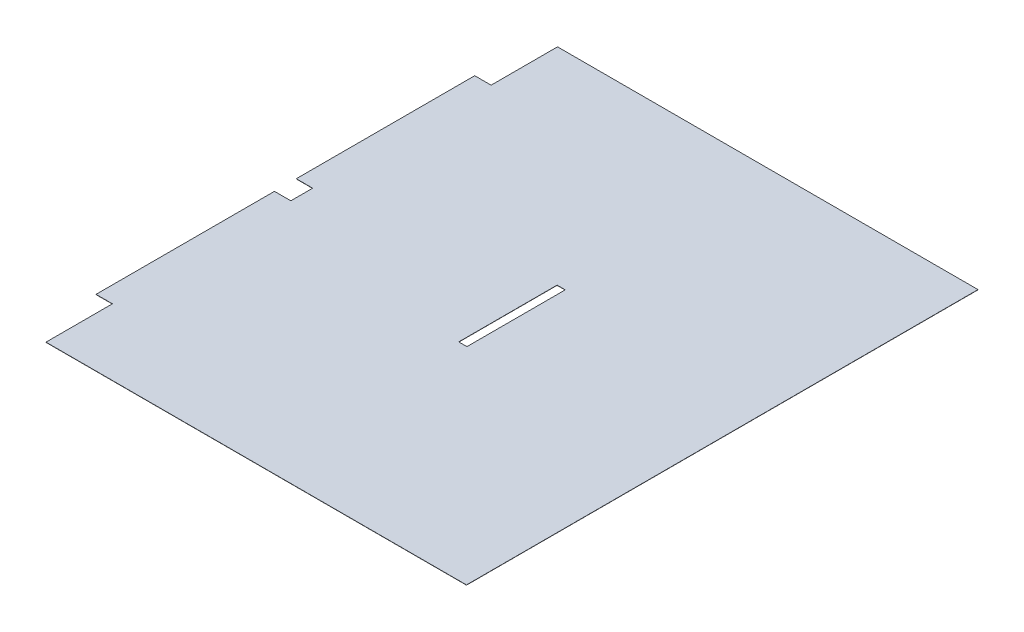
ISO-10303-21;
HEADER;
FILE_DESCRIPTION(('STEP AP214'),'2;1');
FILE_NAME('part.step','',(''),(''),'','','');
FILE_SCHEMA(('AUTOMOTIVE_DESIGN { 1 0 10303 214 1 1 1 1 }'));
ENDSEC;
DATA;
#1=APPLICATION_CONTEXT('core data for automotive mechanical design processes');
#2=APPLICATION_PROTOCOL_DEFINITION('international standard','automotive_design',2000,#1);
#3=PRODUCT_CONTEXT('',#1,'mechanical');
#4=PRODUCT('Part','Part','',(#3));
#5=PRODUCT_RELATED_PRODUCT_CATEGORY('part','',(#4));
#6=PRODUCT_DEFINITION_FORMATION('','',#4);
#7=PRODUCT_DEFINITION_CONTEXT('part definition',#1,'design');
#8=PRODUCT_DEFINITION('design','',#6,#7);
#9=PRODUCT_DEFINITION_SHAPE('','',#8);
#10=(LENGTH_UNIT() NAMED_UNIT(*) SI_UNIT(.MILLI.,.METRE.));
#11=(NAMED_UNIT(*) PLANE_ANGLE_UNIT() SI_UNIT($,.RADIAN.));
#12=(NAMED_UNIT(*) SI_UNIT($,.STERADIAN.) SOLID_ANGLE_UNIT());
#13=UNCERTAINTY_MEASURE_WITH_UNIT(LENGTH_MEASURE(1.E-05),#10,'distance_accuracy_value','');
#14=(GEOMETRIC_REPRESENTATION_CONTEXT(3) GLOBAL_UNCERTAINTY_ASSIGNED_CONTEXT((#13)) GLOBAL_UNIT_ASSIGNED_CONTEXT((#10,
#11,#12)) REPRESENTATION_CONTEXT('',''));
#15=CARTESIAN_POINT('',(0.,0.,0.));
#16=DIRECTION('',(0.,0.,1.));
#17=DIRECTION('',(1.,0.,0.));
#18=AXIS2_PLACEMENT_3D('',#15,#16,#17);
#19=CARTESIAN_POINT('',(-124.475,61.327,0.));
#20=DIRECTION('',(1.,0.,0.));
#21=DIRECTION('',(0.,0.,-1.));
#22=AXIS2_PLACEMENT_3D('',#19,#20,#21);
#23=PLANE('',#22);
#24=DIRECTION('',(0.,0.,1.));
#25=VECTOR('',#24,1.);
#26=CARTESIAN_POINT('',(-124.475,61.2,0.));
#27=LINE('',#26,#25);
#28=CARTESIAN_POINT('',(-124.475,61.2,6.00000000000006));
#29=VERTEX_POINT('',#28);
#30=CARTESIAN_POINT('',(-124.475,61.2,104.));
#31=VERTEX_POINT('',#30);
#32=EDGE_CURVE('E205',#29,#31,#27,.T.);
#33=ORIENTED_EDGE('',*,*,#32,.T.);
#34=DIRECTION('',(0.,-1.,0.));
#35=VECTOR('',#34,1.);
#36=CARTESIAN_POINT('',(-124.475,61.327,104.));
#37=LINE('',#36,#35);
#38=CARTESIAN_POINT('',(-124.475,61.327,104.));
#39=VERTEX_POINT('',#38);
#40=EDGE_CURVE('E11',#39,#31,#37,.T.);
#41=ORIENTED_EDGE('',*,*,#40,.F.);
#42=DIRECTION('',(0.,0.,1.));
#43=VECTOR('',#42,1.);
#44=CARTESIAN_POINT('',(-124.475,61.327,0.));
#45=LINE('',#44,#43);
#46=CARTESIAN_POINT('',(-124.475,61.327,6.00000000000006));
#47=VERTEX_POINT('',#46);
#48=EDGE_CURVE('E461',#47,#39,#45,.T.);
#49=ORIENTED_EDGE('',*,*,#48,.F.);
#50=DIRECTION('',(0.,-1.,0.));
#51=VECTOR('',#50,1.);
#52=CARTESIAN_POINT('',(-124.475,61.327,6.00000000000006));
#53=LINE('',#52,#51);
#54=EDGE_CURVE('E60',#47,#29,#53,.T.);
#55=ORIENTED_EDGE('',*,*,#54,.T.);
#56=EDGE_LOOP('',(#33,#41,#49,#55));
#57=FACE_BOUND('',#56,.T.);
#58=ADVANCED_FACE('F41',(#57),#23,.F.);
#59=CARTESIAN_POINT('',(0.,61.327,104.));
#60=DIRECTION('',(0.,0.,-1.));
#61=DIRECTION('',(-1.,0.,0.));
#62=AXIS2_PLACEMENT_3D('',#59,#60,#61);
#63=PLANE('',#62);
#64=DIRECTION('',(1.,0.,0.));
#65=VECTOR('',#64,1.);
#66=CARTESIAN_POINT('',(0.,61.2,104.));
#67=LINE('',#66,#65);
#68=CARTESIAN_POINT('',(-115.475,61.2,104.));
#69=VERTEX_POINT('',#68);
#70=EDGE_CURVE('E207',#31,#69,#67,.T.);
#71=ORIENTED_EDGE('',*,*,#70,.T.);
#72=DIRECTION('',(0.,-1.,0.));
#73=VECTOR('',#72,1.);
#74=CARTESIAN_POINT('',(-115.475,61.327,104.));
#75=LINE('',#74,#73);
#76=CARTESIAN_POINT('',(-115.475,61.327,104.));
#77=VERTEX_POINT('',#76);
#78=EDGE_CURVE('E51',#77,#69,#75,.T.);
#79=ORIENTED_EDGE('',*,*,#78,.F.);
#80=DIRECTION('',(1.,0.,0.));
#81=VECTOR('',#80,1.);
#82=CARTESIAN_POINT('',(0.,61.327,104.));
#83=LINE('',#82,#81);
#84=EDGE_CURVE('E464',#39,#77,#83,.T.);
#85=ORIENTED_EDGE('',*,*,#84,.F.);
#86=ORIENTED_EDGE('',*,*,#40,.T.);
#87=EDGE_LOOP('',(#71,#79,#85,#86));
#88=FACE_BOUND('',#87,.T.);
#89=ADVANCED_FACE('F283',(#88),#63,.F.);
#90=CARTESIAN_POINT('',(-115.475,61.327,1.31805692702457E-13));
#91=DIRECTION('',(1.,0.,0.));
#92=DIRECTION('',(0.,0.,-1.));
#93=AXIS2_PLACEMENT_3D('',#90,#91,#92);
#94=PLANE('',#93);
#95=DIRECTION('',(0.,0.,1.));
#96=VECTOR('',#95,1.);
#97=CARTESIAN_POINT('',(-115.475,61.2,1.31805692702457E-13));
#98=LINE('',#97,#96);
#99=CARTESIAN_POINT('',(-115.475,61.2,140.475));
#100=VERTEX_POINT('',#99);
#101=EDGE_CURVE('E210',#69,#100,#98,.T.);
#102=ORIENTED_EDGE('',*,*,#101,.T.);
#103=DIRECTION('',(0.,-1.,0.));
#104=VECTOR('',#103,1.);
#105=CARTESIAN_POINT('',(-115.475,61.327,140.475));
#106=LINE('',#105,#104);
#107=CARTESIAN_POINT('',(-115.475,61.327,140.475));
#108=VERTEX_POINT('',#107);
#109=EDGE_CURVE('E247',#108,#100,#106,.T.);
#110=ORIENTED_EDGE('',*,*,#109,.F.);
#111=DIRECTION('',(0.,0.,1.));
#112=VECTOR('',#111,1.);
#113=CARTESIAN_POINT('',(-115.475,61.327,1.31805692702457E-13));
#114=LINE('',#113,#112);
#115=EDGE_CURVE('E453',#77,#108,#114,.T.);
#116=ORIENTED_EDGE('',*,*,#115,.F.);
#117=ORIENTED_EDGE('',*,*,#78,.T.);
#118=EDGE_LOOP('',(#102,#110,#116,#117));
#119=FACE_BOUND('',#118,.T.);
#120=ADVANCED_FACE('F289',(#119),#94,.F.);
#121=CARTESIAN_POINT('',(0.,61.327,140.475));
#122=DIRECTION('',(0.,0.,-1.));
#123=DIRECTION('',(-1.,0.,0.));
#124=AXIS2_PLACEMENT_3D('',#121,#122,#123);
#125=PLANE('',#124);
#126=DIRECTION('',(1.,0.,0.));
#127=VECTOR('',#126,1.);
#128=CARTESIAN_POINT('',(0.,61.2,140.475));
#129=LINE('',#128,#127);
#130=CARTESIAN_POINT('',(115.475,61.2,140.475));
#131=VERTEX_POINT('',#130);
#132=EDGE_CURVE('E212',#100,#131,#129,.T.);
#133=ORIENTED_EDGE('',*,*,#132,.T.);
#134=DIRECTION('',(0.,-1.,0.));
#135=VECTOR('',#134,1.);
#136=CARTESIAN_POINT('',(115.475,61.327,140.475));
#137=LINE('',#136,#135);
#138=CARTESIAN_POINT('',(115.475,61.327,140.475));
#139=VERTEX_POINT('',#138);
#140=EDGE_CURVE('E245',#139,#131,#137,.T.);
#141=ORIENTED_EDGE('',*,*,#140,.F.);
#142=DIRECTION('',(1.,0.,0.));
#143=VECTOR('',#142,1.);
#144=CARTESIAN_POINT('',(0.,61.327,140.475));
#145=LINE('',#144,#143);
#146=EDGE_CURVE('E441',#108,#139,#145,.T.);
#147=ORIENTED_EDGE('',*,*,#146,.F.);
#148=ORIENTED_EDGE('',*,*,#109,.T.);
#149=EDGE_LOOP('',(#133,#141,#147,#148));
#150=FACE_BOUND('',#149,.T.);
#151=ADVANCED_FACE('F398',(#150),#125,.F.);
#152=CARTESIAN_POINT('',(115.475,61.327,0.));
#153=DIRECTION('',(1.,0.,0.));
#154=DIRECTION('',(0.,0.,-1.));
#155=AXIS2_PLACEMENT_3D('',#152,#153,#154);
#156=PLANE('',#155);
#157=DIRECTION('',(0.,0.,1.));
#158=VECTOR('',#157,1.);
#159=CARTESIAN_POINT('',(115.475,61.2,0.));
#160=LINE('',#159,#158);
#161=CARTESIAN_POINT('',(115.475,61.2,-140.475));
#162=VERTEX_POINT('',#161);
#163=EDGE_CURVE('E215',#162,#131,#160,.T.);
#164=ORIENTED_EDGE('',*,*,#163,.F.);
#165=DIRECTION('',(0.,-1.,0.));
#166=VECTOR('',#165,1.);
#167=CARTESIAN_POINT('',(115.475,61.327,-140.475));
#168=LINE('',#167,#166);
#169=CARTESIAN_POINT('',(115.475,61.327,-140.475));
#170=VERTEX_POINT('',#169);
#171=EDGE_CURVE('E243',#170,#162,#168,.T.);
#172=ORIENTED_EDGE('',*,*,#171,.F.);
#173=DIRECTION('',(0.,0.,1.));
#174=VECTOR('',#173,1.);
#175=CARTESIAN_POINT('',(115.475,61.327,0.));
#176=LINE('',#175,#174);
#177=EDGE_CURVE('E446',#170,#139,#176,.T.);
#178=ORIENTED_EDGE('',*,*,#177,.T.);
#179=ORIENTED_EDGE('',*,*,#140,.T.);
#180=EDGE_LOOP('',(#164,#172,#178,#179));
#181=FACE_BOUND('',#180,.T.);
#182=ADVANCED_FACE('F389',(#181),#156,.T.);
#183=CARTESIAN_POINT('',(0.,61.327,-140.475));
#184=DIRECTION('',(0.,0.,-1.));
#185=DIRECTION('',(-1.,0.,0.));
#186=AXIS2_PLACEMENT_3D('',#183,#184,#185);
#187=PLANE('',#186);
#188=DIRECTION('',(1.,0.,0.));
#189=VECTOR('',#188,1.);
#190=CARTESIAN_POINT('',(0.,61.2,-140.475));
#191=LINE('',#190,#189);
#192=CARTESIAN_POINT('',(-115.475,61.2,-140.475));
#193=VERTEX_POINT('',#192);
#194=EDGE_CURVE('E218',#193,#162,#191,.T.);
#195=ORIENTED_EDGE('',*,*,#194,.F.);
#196=DIRECTION('',(0.,-1.,0.));
#197=VECTOR('',#196,1.);
#198=CARTESIAN_POINT('',(-115.475,61.327,-140.475));
#199=LINE('',#198,#197);
#200=CARTESIAN_POINT('',(-115.475,61.327,-140.475));
#201=VERTEX_POINT('',#200);
#202=EDGE_CURVE('E241',#201,#193,#199,.T.);
#203=ORIENTED_EDGE('',*,*,#202,.F.);
#204=DIRECTION('',(1.,0.,0.));
#205=VECTOR('',#204,1.);
#206=CARTESIAN_POINT('',(0.,61.327,-140.475));
#207=LINE('',#206,#205);
#208=EDGE_CURVE('E449',#201,#170,#207,.T.);
#209=ORIENTED_EDGE('',*,*,#208,.T.);
#210=ORIENTED_EDGE('',*,*,#171,.T.);
#211=EDGE_LOOP('',(#195,#203,#209,#210));
#212=FACE_BOUND('',#211,.T.);
#213=ADVANCED_FACE('F380',(#212),#187,.T.);
#214=CARTESIAN_POINT('',(-115.475,61.327,0.));
#215=DIRECTION('',(-1.,0.,0.));
#216=DIRECTION('',(0.,0.,1.));
#217=AXIS2_PLACEMENT_3D('',#214,#215,#216);
#218=PLANE('',#217);
#219=DIRECTION('',(0.,0.,-1.));
#220=VECTOR('',#219,1.);
#221=CARTESIAN_POINT('',(-115.475,61.2,0.));
#222=LINE('',#221,#220);
#223=CARTESIAN_POINT('',(-115.475,61.2,-104.));
#224=VERTEX_POINT('',#223);
#225=EDGE_CURVE('E221',#224,#193,#222,.T.);
#226=ORIENTED_EDGE('',*,*,#225,.F.);
#227=DIRECTION('',(0.,-1.,0.));
#228=VECTOR('',#227,1.);
#229=CARTESIAN_POINT('',(-115.475,61.327,-104.));
#230=LINE('',#229,#228);
#231=CARTESIAN_POINT('',(-115.475,61.327,-104.));
#232=VERTEX_POINT('',#231);
#233=EDGE_CURVE('E239',#232,#224,#230,.T.);
#234=ORIENTED_EDGE('',*,*,#233,.F.);
#235=DIRECTION('',(0.,0.,-1.));
#236=VECTOR('',#235,1.);
#237=CARTESIAN_POINT('',(-115.475,61.327,0.));
#238=LINE('',#237,#236);
#239=EDGE_CURVE('E451',#232,#201,#238,.T.);
#240=ORIENTED_EDGE('',*,*,#239,.T.);
#241=ORIENTED_EDGE('',*,*,#202,.T.);
#242=EDGE_LOOP('',(#226,#234,#240,#241));
#243=FACE_BOUND('',#242,.T.);
#244=ADVANCED_FACE('F301',(#243),#218,.T.);
#245=CARTESIAN_POINT('',(0.,61.327,-104.));
#246=DIRECTION('',(0.,0.,-1.));
#247=DIRECTION('',(-1.,0.,0.));
#248=AXIS2_PLACEMENT_3D('',#245,#246,#247);
#249=PLANE('',#248);
#250=DIRECTION('',(1.,0.,0.));
#251=VECTOR('',#250,1.);
#252=CARTESIAN_POINT('',(0.,61.2,-104.));
#253=LINE('',#252,#251);
#254=CARTESIAN_POINT('',(-124.475,61.2,-104.));
#255=VERTEX_POINT('',#254);
#256=EDGE_CURVE('E224',#255,#224,#253,.T.);
#257=ORIENTED_EDGE('',*,*,#256,.F.);
#258=DIRECTION('',(0.,-1.,0.));
#259=VECTOR('',#258,1.);
#260=CARTESIAN_POINT('',(-124.475,61.327,-104.));
#261=LINE('',#260,#259);
#262=CARTESIAN_POINT('',(-124.475,61.327,-104.));
#263=VERTEX_POINT('',#262);
#264=EDGE_CURVE('E237',#263,#255,#261,.T.);
#265=ORIENTED_EDGE('',*,*,#264,.F.);
#266=DIRECTION('',(1.,0.,0.));
#267=VECTOR('',#266,1.);
#268=CARTESIAN_POINT('',(0.,61.327,-104.));
#269=LINE('',#268,#267);
#270=EDGE_CURVE('E458',#263,#232,#269,.T.);
#271=ORIENTED_EDGE('',*,*,#270,.T.);
#272=ORIENTED_EDGE('',*,*,#233,.T.);
#273=EDGE_LOOP('',(#257,#265,#271,#272));
#274=FACE_BOUND('',#273,.T.);
#275=ADVANCED_FACE('F295',(#274),#249,.T.);
#276=CARTESIAN_POINT('',(-124.475,61.2,-5.99999999999994));
#277=VERTEX_POINT('',#276);
#278=EDGE_CURVE('E208',#255,#277,#27,.T.);
#279=ORIENTED_EDGE('',*,*,#278,.T.);
#280=DIRECTION('',(0.,-1.,0.));
#281=VECTOR('',#280,1.);
#282=CARTESIAN_POINT('',(-124.475,61.327,-5.99999999999994));
#283=LINE('',#282,#281);
#284=CARTESIAN_POINT('',(-124.475,61.327,-5.99999999999994));
#285=VERTEX_POINT('',#284);
#286=EDGE_CURVE('E184',#285,#277,#283,.T.);
#287=ORIENTED_EDGE('',*,*,#286,.F.);
#288=EDGE_CURVE('E172',#263,#285,#45,.T.);
#289=ORIENTED_EDGE('',*,*,#288,.F.);
#290=ORIENTED_EDGE('',*,*,#264,.T.);
#291=EDGE_LOOP('',(#279,#287,#289,#290));
#292=FACE_BOUND('',#291,.T.);
#293=ADVANCED_FACE('F285',(#292),#23,.F.);
#294=CARTESIAN_POINT('',(0.,61.327,-5.99999999999994));
#295=DIRECTION('',(0.,0.,-1.));
#296=DIRECTION('',(-1.,0.,0.));
#297=AXIS2_PLACEMENT_3D('',#294,#295,#296);
#298=PLANE('',#297);
#299=DIRECTION('',(1.,0.,0.));
#300=VECTOR('',#299,1.);
#301=CARTESIAN_POINT('',(0.,61.2,-5.99999999999994));
#302=LINE('',#301,#300);
#303=CARTESIAN_POINT('',(-115.475,61.2,-5.99999999999994));
#304=VERTEX_POINT('',#303);
#305=EDGE_CURVE('E181',#277,#304,#302,.T.);
#306=ORIENTED_EDGE('',*,*,#305,.T.);
#307=DIRECTION('',(0.,-1.,0.));
#308=VECTOR('',#307,1.);
#309=CARTESIAN_POINT('',(-115.475,61.327,-5.99999999999994));
#310=LINE('',#309,#308);
#311=CARTESIAN_POINT('',(-115.475,61.327,-5.99999999999994));
#312=VERTEX_POINT('',#311);
#313=EDGE_CURVE('E178',#312,#304,#310,.T.);
#314=ORIENTED_EDGE('',*,*,#313,.F.);
#315=DIRECTION('',(1.,0.,0.));
#316=VECTOR('',#315,1.);
#317=CARTESIAN_POINT('',(0.,61.327,-5.99999999999994));
#318=LINE('',#317,#316);
#319=EDGE_CURVE('E163',#285,#312,#318,.T.);
#320=ORIENTED_EDGE('',*,*,#319,.F.);
#321=ORIENTED_EDGE('',*,*,#286,.T.);
#322=EDGE_LOOP('',(#306,#314,#320,#321));
#323=FACE_BOUND('',#322,.T.);
#324=ADVANCED_FACE('F179',(#323),#298,.F.);
#325=CARTESIAN_POINT('',(-115.475,61.327,0.));
#326=DIRECTION('',(1.,0.,0.));
#327=DIRECTION('',(0.,0.,-1.));
#328=AXIS2_PLACEMENT_3D('',#325,#326,#327);
#329=PLANE('',#328);
#330=DIRECTION('',(0.,0.,1.));
#331=VECTOR('',#330,1.);
#332=CARTESIAN_POINT('',(-115.475,61.2,0.));
#333=LINE('',#332,#331);
#334=CARTESIAN_POINT('',(-115.475,61.2,6.00000000000006));
#335=VERTEX_POINT('',#334);
#336=EDGE_CURVE('E228',#304,#335,#333,.T.);
#337=ORIENTED_EDGE('',*,*,#336,.T.);
#338=DIRECTION('',(0.,-1.,0.));
#339=VECTOR('',#338,1.);
#340=CARTESIAN_POINT('',(-115.475,61.327,6.00000000000006));
#341=LINE('',#340,#339);
#342=CARTESIAN_POINT('',(-115.475,61.327,6.00000000000006));
#343=VERTEX_POINT('',#342);
#344=EDGE_CURVE('E111',#343,#335,#341,.T.);
#345=ORIENTED_EDGE('',*,*,#344,.F.);
#346=DIRECTION('',(0.,0.,1.));
#347=VECTOR('',#346,1.);
#348=CARTESIAN_POINT('',(-115.475,61.327,0.));
#349=LINE('',#348,#347);
#350=EDGE_CURVE('E169',#312,#343,#349,.T.);
#351=ORIENTED_EDGE('',*,*,#350,.F.);
#352=ORIENTED_EDGE('',*,*,#313,.T.);
#353=EDGE_LOOP('',(#337,#345,#351,#352));
#354=FACE_BOUND('',#353,.T.);
#355=ADVANCED_FACE('F186',(#354),#329,.F.);
#356=CARTESIAN_POINT('',(0.,61.327,-27.));
#357=DIRECTION('',(0.,0.,-1.));
#358=DIRECTION('',(-1.,0.,0.));
#359=AXIS2_PLACEMENT_3D('',#356,#357,#358);
#360=PLANE('',#359);
#361=DIRECTION('',(1.,0.,0.));
#362=VECTOR('',#361,1.);
#363=CARTESIAN_POINT('',(0.,61.2,-27.));
#364=LINE('',#363,#362);
#365=CARTESIAN_POINT('',(-2.25,61.2,-27.));
#366=VERTEX_POINT('',#365);
#367=CARTESIAN_POINT('',(2.25,61.2,-27.));
#368=VERTEX_POINT('',#367);
#369=EDGE_CURVE('E193',#366,#368,#364,.T.);
#370=ORIENTED_EDGE('',*,*,#369,.T.);
#371=DIRECTION('',(0.,-1.,0.));
#372=VECTOR('',#371,1.);
#373=CARTESIAN_POINT('',(2.25,61.327,-27.));
#374=LINE('',#373,#372);
#375=CARTESIAN_POINT('',(2.25,61.327,-27.));
#376=VERTEX_POINT('',#375);
#377=EDGE_CURVE('E45',#376,#368,#374,.T.);
#378=ORIENTED_EDGE('',*,*,#377,.F.);
#379=DIRECTION('',(1.,0.,0.));
#380=VECTOR('',#379,1.);
#381=CARTESIAN_POINT('',(0.,61.327,-27.));
#382=LINE('',#381,#380);
#383=CARTESIAN_POINT('',(-2.25,61.327,-27.));
#384=VERTEX_POINT('',#383);
#385=EDGE_CURVE('E233',#384,#376,#382,.T.);
#386=ORIENTED_EDGE('',*,*,#385,.F.);
#387=DIRECTION('',(0.,-1.,0.));
#388=VECTOR('',#387,1.);
#389=CARTESIAN_POINT('',(-2.25,61.327,-27.));
#390=LINE('',#389,#388);
#391=EDGE_CURVE('E189',#384,#366,#390,.T.);
#392=ORIENTED_EDGE('',*,*,#391,.T.);
#393=EDGE_LOOP('',(#370,#378,#386,#392));
#394=FACE_BOUND('',#393,.T.);
#395=ADVANCED_FACE('F43',(#394),#360,.F.);
#396=CARTESIAN_POINT('',(2.25,61.327,0.));
#397=DIRECTION('',(1.,0.,0.));
#398=DIRECTION('',(0.,0.,-1.));
#399=AXIS2_PLACEMENT_3D('',#396,#397,#398);
#400=PLANE('',#399);
#401=DIRECTION('',(0.,0.,1.));
#402=VECTOR('',#401,1.);
#403=CARTESIAN_POINT('',(2.25,61.2,0.));
#404=LINE('',#403,#402);
#405=CARTESIAN_POINT('',(2.25,61.2,27.));
#406=VERTEX_POINT('',#405);
#407=EDGE_CURVE('E196',#368,#406,#404,.T.);
#408=ORIENTED_EDGE('',*,*,#407,.T.);
#409=DIRECTION('',(0.,-1.,0.));
#410=VECTOR('',#409,1.);
#411=CARTESIAN_POINT('',(2.25,61.327,27.));
#412=LINE('',#411,#410);
#413=CARTESIAN_POINT('',(2.25,61.327,27.));
#414=VERTEX_POINT('',#413);
#415=EDGE_CURVE('E254',#414,#406,#412,.T.);
#416=ORIENTED_EDGE('',*,*,#415,.F.);
#417=DIRECTION('',(0.,0.,1.));
#418=VECTOR('',#417,1.);
#419=CARTESIAN_POINT('',(2.25,61.327,0.));
#420=LINE('',#419,#418);
#421=EDGE_CURVE('E124',#376,#414,#420,.T.);
#422=ORIENTED_EDGE('',*,*,#421,.F.);
#423=ORIENTED_EDGE('',*,*,#377,.T.);
#424=EDGE_LOOP('',(#408,#416,#422,#423));
#425=FACE_BOUND('',#424,.T.);
#426=ADVANCED_FACE('F259',(#425),#400,.F.);
#427=CARTESIAN_POINT('',(0.,61.327,27.));
#428=DIRECTION('',(0.,0.,-1.));
#429=DIRECTION('',(-1.,0.,0.));
#430=AXIS2_PLACEMENT_3D('',#427,#428,#429);
#431=PLANE('',#430);
#432=DIRECTION('',(1.,0.,0.));
#433=VECTOR('',#432,1.);
#434=CARTESIAN_POINT('',(0.,61.2,27.));
#435=LINE('',#434,#433);
#436=CARTESIAN_POINT('',(-2.25,61.2,27.));
#437=VERTEX_POINT('',#436);
#438=EDGE_CURVE('E199',#437,#406,#435,.T.);
#439=ORIENTED_EDGE('',*,*,#438,.F.);
#440=DIRECTION('',(0.,-1.,0.));
#441=VECTOR('',#440,1.);
#442=CARTESIAN_POINT('',(-2.25,61.327,27.));
#443=LINE('',#442,#441);
#444=CARTESIAN_POINT('',(-2.25,61.327,27.));
#445=VERTEX_POINT('',#444);
#446=EDGE_CURVE('E253',#445,#437,#443,.T.);
#447=ORIENTED_EDGE('',*,*,#446,.F.);
#448=DIRECTION('',(1.,0.,0.));
#449=VECTOR('',#448,1.);
#450=CARTESIAN_POINT('',(0.,61.327,27.));
#451=LINE('',#450,#449);
#452=EDGE_CURVE('E466',#445,#414,#451,.T.);
#453=ORIENTED_EDGE('',*,*,#452,.T.);
#454=ORIENTED_EDGE('',*,*,#415,.T.);
#455=EDGE_LOOP('',(#439,#447,#453,#454));
#456=FACE_BOUND('',#455,.T.);
#457=ADVANCED_FACE('F273',(#456),#431,.T.);
#458=CARTESIAN_POINT('',(-2.25,61.327,0.));
#459=DIRECTION('',(1.,0.,0.));
#460=DIRECTION('',(0.,0.,-1.));
#461=AXIS2_PLACEMENT_3D('',#458,#459,#460);
#462=PLANE('',#461);
#463=DIRECTION('',(0.,0.,1.));
#464=VECTOR('',#463,1.);
#465=CARTESIAN_POINT('',(-2.25,61.2,0.));
#466=LINE('',#465,#464);
#467=EDGE_CURVE('E202',#366,#437,#466,.T.);
#468=ORIENTED_EDGE('',*,*,#467,.F.);
#469=ORIENTED_EDGE('',*,*,#391,.F.);
#470=DIRECTION('',(0.,0.,1.));
#471=VECTOR('',#470,1.);
#472=CARTESIAN_POINT('',(-2.25,61.327,0.));
#473=LINE('',#472,#471);
#474=EDGE_CURVE('E271',#384,#445,#473,.T.);
#475=ORIENTED_EDGE('',*,*,#474,.T.);
#476=ORIENTED_EDGE('',*,*,#446,.T.);
#477=EDGE_LOOP('',(#468,#469,#475,#476));
#478=FACE_BOUND('',#477,.T.);
#479=ADVANCED_FACE('F268',(#478),#462,.T.);
#480=CARTESIAN_POINT('',(0.,61.327,6.00000000000006));
#481=DIRECTION('',(0.,0.,-1.));
#482=DIRECTION('',(-1.,0.,0.));
#483=AXIS2_PLACEMENT_3D('',#480,#481,#482);
#484=PLANE('',#483);
#485=DIRECTION('',(1.,0.,0.));
#486=VECTOR('',#485,1.);
#487=CARTESIAN_POINT('',(0.,61.2,6.00000000000006));
#488=LINE('',#487,#486);
#489=EDGE_CURVE('E230',#29,#335,#488,.T.);
#490=ORIENTED_EDGE('',*,*,#489,.F.);
#491=ORIENTED_EDGE('',*,*,#54,.F.);
#492=DIRECTION('',(1.,0.,0.));
#493=VECTOR('',#492,1.);
#494=CARTESIAN_POINT('',(0.,61.327,6.00000000000006));
#495=LINE('',#494,#493);
#496=EDGE_CURVE('E187',#47,#343,#495,.T.);
#497=ORIENTED_EDGE('',*,*,#496,.T.);
#498=ORIENTED_EDGE('',*,*,#344,.T.);
#499=EDGE_LOOP('',(#490,#491,#497,#498));
#500=FACE_BOUND('',#499,.T.);
#501=ADVANCED_FACE('F280',(#500),#484,.T.);
#502=CARTESIAN_POINT('',(0.,61.327,0.));
#503=DIRECTION('',(0.,1.,0.));
#504=DIRECTION('',(0.,0.,1.));
#505=AXIS2_PLACEMENT_3D('',#502,#503,#504);
#506=PLANE('',#505);
#507=ORIENTED_EDGE('',*,*,#385,.T.);
#508=ORIENTED_EDGE('',*,*,#421,.T.);
#509=ORIENTED_EDGE('',*,*,#452,.F.);
#510=ORIENTED_EDGE('',*,*,#474,.F.);
#511=EDGE_LOOP('',(#507,#508,#509,#510));
#512=FACE_BOUND('',#511,.T.);
#513=ORIENTED_EDGE('',*,*,#48,.T.);
#514=ORIENTED_EDGE('',*,*,#84,.T.);
#515=ORIENTED_EDGE('',*,*,#115,.T.);
#516=ORIENTED_EDGE('',*,*,#146,.T.);
#517=ORIENTED_EDGE('',*,*,#177,.F.);
#518=ORIENTED_EDGE('',*,*,#208,.F.);
#519=ORIENTED_EDGE('',*,*,#239,.F.);
#520=ORIENTED_EDGE('',*,*,#270,.F.);
#521=ORIENTED_EDGE('',*,*,#288,.T.);
#522=ORIENTED_EDGE('',*,*,#319,.T.);
#523=ORIENTED_EDGE('',*,*,#350,.T.);
#524=ORIENTED_EDGE('',*,*,#496,.F.);
#525=EDGE_LOOP('',(#513,#514,#515,#516,#517,#518,#519,#520,#521,#522,#523,#524));
#526=FACE_BOUND('',#525,.T.);
#527=ADVANCED_FACE('F166',(#512,#526),#506,.T.);
#528=CARTESIAN_POINT('',(0.,61.2,0.));
#529=DIRECTION('',(0.,1.,0.));
#530=DIRECTION('',(0.,0.,1.));
#531=AXIS2_PLACEMENT_3D('',#528,#529,#530);
#532=PLANE('',#531);
#533=ORIENTED_EDGE('',*,*,#369,.F.);
#534=ORIENTED_EDGE('',*,*,#467,.T.);
#535=ORIENTED_EDGE('',*,*,#438,.T.);
#536=ORIENTED_EDGE('',*,*,#407,.F.);
#537=EDGE_LOOP('',(#533,#534,#535,#536));
#538=FACE_BOUND('',#537,.T.);
#539=ORIENTED_EDGE('',*,*,#32,.F.);
#540=ORIENTED_EDGE('',*,*,#489,.T.);
#541=ORIENTED_EDGE('',*,*,#336,.F.);
#542=ORIENTED_EDGE('',*,*,#305,.F.);
#543=ORIENTED_EDGE('',*,*,#278,.F.);
#544=ORIENTED_EDGE('',*,*,#256,.T.);
#545=ORIENTED_EDGE('',*,*,#225,.T.);
#546=ORIENTED_EDGE('',*,*,#194,.T.);
#547=ORIENTED_EDGE('',*,*,#163,.T.);
#548=ORIENTED_EDGE('',*,*,#132,.F.);
#549=ORIENTED_EDGE('',*,*,#101,.F.);
#550=ORIENTED_EDGE('',*,*,#70,.F.);
#551=EDGE_LOOP('',(#539,#540,#541,#542,#543,#544,#545,#546,#547,#548,#549,#550));
#552=FACE_BOUND('',#551,.T.);
#553=ADVANCED_FACE('F265',(#538,#552),#532,.F.);
#554=CLOSED_SHELL('',(#58,#89,#120,#151,#182,#213,#244,#275,#293,#324,#355,#395,#426,#457,#479,
#501,#527,#553));
#555=MANIFOLD_SOLID_BREP('B2',#554);
#556=ADVANCED_BREP_SHAPE_REPRESENTATION('',(#18,#555),#14);
#557=SHAPE_DEFINITION_REPRESENTATION(#9,#556);
ENDSEC;
END-ISO-10303-21;
